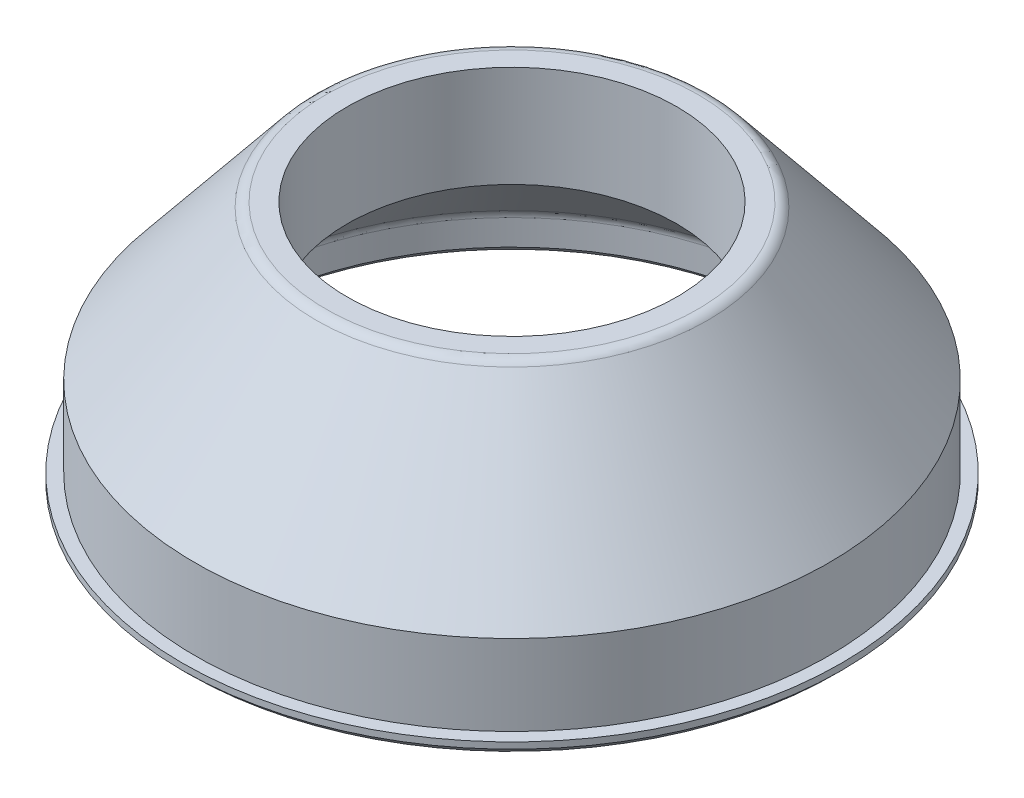
ISO-10303-21;
HEADER;
FILE_DESCRIPTION(('STEP AP214'),'2;1');
FILE_NAME('part.step','',(''),(''),'','','');
FILE_SCHEMA(('AUTOMOTIVE_DESIGN { 1 0 10303 214 1 1 1 1 }'));
ENDSEC;
DATA;
#1=APPLICATION_CONTEXT('core data for automotive mechanical design processes');
#2=APPLICATION_PROTOCOL_DEFINITION('international standard','automotive_design',2000,#1);
#3=PRODUCT_CONTEXT('',#1,'mechanical');
#4=PRODUCT('Part','Part','',(#3));
#5=PRODUCT_RELATED_PRODUCT_CATEGORY('part','',(#4));
#6=PRODUCT_DEFINITION_FORMATION('','',#4);
#7=PRODUCT_DEFINITION_CONTEXT('part definition',#1,'design');
#8=PRODUCT_DEFINITION('design','',#6,#7);
#9=PRODUCT_DEFINITION_SHAPE('','',#8);
#10=(LENGTH_UNIT() NAMED_UNIT(*) SI_UNIT(.MILLI.,.METRE.));
#11=(NAMED_UNIT(*) PLANE_ANGLE_UNIT() SI_UNIT($,.RADIAN.));
#12=(NAMED_UNIT(*) SI_UNIT($,.STERADIAN.) SOLID_ANGLE_UNIT());
#13=UNCERTAINTY_MEASURE_WITH_UNIT(LENGTH_MEASURE(1.E-05),#10,'distance_accuracy_value','');
#14=(GEOMETRIC_REPRESENTATION_CONTEXT(3) GLOBAL_UNCERTAINTY_ASSIGNED_CONTEXT((#13)) GLOBAL_UNIT_ASSIGNED_CONTEXT((#10,
#11,#12)) REPRESENTATION_CONTEXT('',''));
#15=CARTESIAN_POINT('',(0.,0.,0.));
#16=DIRECTION('',(0.,0.,1.));
#17=DIRECTION('',(1.,0.,0.));
#18=AXIS2_PLACEMENT_3D('',#15,#16,#17);
#19=CARTESIAN_POINT('',(0.,0.,0.));
#20=DIRECTION('',(0.,-1.,0.));
#21=DIRECTION('',(0.,0.,-1.));
#22=AXIS2_PLACEMENT_3D('',#19,#20,#21);
#23=CYLINDRICAL_SURFACE('',#22,26.);
#24=CARTESIAN_POINT('',(0.,0.499999999999997,0.));
#25=DIRECTION('',(0.,1.,0.));
#26=DIRECTION('',(0.,0.,1.));
#27=AXIS2_PLACEMENT_3D('',#24,#25,#26);
#28=CIRCLE('',#27,26.);
#29=CARTESIAN_POINT('',(0.,0.499999999999997,26.));
#30=VERTEX_POINT('',#29);
#31=EDGE_CURVE('E10',#30,#30,#28,.T.);
#32=ORIENTED_EDGE('',*,*,#31,.T.);
#33=EDGE_LOOP('',(#32));
#34=FACE_BOUND('',#33,.T.);
#35=CARTESIAN_POINT('',(0.,1.,0.));
#36=DIRECTION('',(0.,-1.,0.));
#37=DIRECTION('',(0.,0.,-1.));
#38=AXIS2_PLACEMENT_3D('',#35,#36,#37);
#39=CIRCLE('',#38,26.);
#40=CARTESIAN_POINT('',(0.,1.,-26.));
#41=VERTEX_POINT('',#40);
#42=EDGE_CURVE('E106',#41,#41,#39,.T.);
#43=ORIENTED_EDGE('',*,*,#42,.T.);
#44=EDGE_LOOP('',(#43));
#45=FACE_BOUND('',#44,.T.);
#46=ADVANCED_FACE('F45',(#34,#45),#23,.T.);
#47=CARTESIAN_POINT('',(-26.,0.,0.));
#48=DIRECTION('',(0.,1.,0.));
#49=DIRECTION('',(0.,0.,1.));
#50=AXIS2_PLACEMENT_3D('',#47,#48,#49);
#51=PLANE('',#50);
#52=CARTESIAN_POINT('',(0.,0.,0.));
#53=DIRECTION('',(0.,1.,0.));
#54=DIRECTION('',(0.,0.,1.));
#55=AXIS2_PLACEMENT_3D('',#52,#53,#54);
#56=CIRCLE('',#55,23.);
#57=CARTESIAN_POINT('',(0.,0.,23.));
#58=VERTEX_POINT('',#57);
#59=EDGE_CURVE('E54',#58,#58,#56,.T.);
#60=ORIENTED_EDGE('',*,*,#59,.T.);
#61=EDGE_LOOP('',(#60));
#62=FACE_BOUND('',#61,.T.);
#63=CARTESIAN_POINT('',(0.,0.,0.));
#64=DIRECTION('',(0.,1.,0.));
#65=DIRECTION('',(0.,0.,1.));
#66=AXIS2_PLACEMENT_3D('',#63,#64,#65);
#67=CIRCLE('',#66,25.5);
#68=CARTESIAN_POINT('',(0.,0.,25.5));
#69=VERTEX_POINT('',#68);
#70=EDGE_CURVE('E59',#69,#69,#67,.F.);
#71=ORIENTED_EDGE('',*,*,#70,.T.);
#72=EDGE_LOOP('',(#71));
#73=FACE_BOUND('',#72,.T.);
#74=ADVANCED_FACE('F138',(#62,#73),#51,.F.);
#75=CARTESIAN_POINT('',(0.,0.,0.));
#76=DIRECTION('',(0.,-1.,0.));
#77=DIRECTION('',(0.,0.,-1.));
#78=AXIS2_PLACEMENT_3D('',#75,#76,#77);
#79=CYLINDRICAL_SURFACE('',#78,22.5);
#80=CARTESIAN_POINT('',(0.,0.499999999999987,0.));
#81=DIRECTION('',(0.,1.,0.));
#82=DIRECTION('',(0.,0.,1.));
#83=AXIS2_PLACEMENT_3D('',#80,#81,#82);
#84=CIRCLE('',#83,22.5);
#85=CARTESIAN_POINT('',(0.,0.499999999999987,22.5));
#86=VERTEX_POINT('',#85);
#87=EDGE_CURVE('E64',#86,#86,#84,.F.);
#88=ORIENTED_EDGE('',*,*,#87,.T.);
#89=EDGE_LOOP('',(#88));
#90=FACE_BOUND('',#89,.T.);
#91=CARTESIAN_POINT('',(0.,2.517766402722,0.));
#92=DIRECTION('',(0.,-1.,0.));
#93=DIRECTION('',(0.,0.,-1.));
#94=AXIS2_PLACEMENT_3D('',#91,#92,#93);
#95=CIRCLE('',#94,22.5);
#96=CARTESIAN_POINT('',(0.,2.517766402722,-22.5));
#97=VERTEX_POINT('',#96);
#98=EDGE_CURVE('E70',#97,#97,#95,.F.);
#99=ORIENTED_EDGE('',*,*,#98,.T.);
#100=EDGE_LOOP('',(#99));
#101=FACE_BOUND('',#100,.T.);
#102=ADVANCED_FACE('F144',(#90,#101),#79,.F.);
#103=CARTESIAN_POINT('',(0.,2.87241726725528,0.));
#104=DIRECTION('',(0.,-1.,0.));
#105=DIRECTION('',(0.,0.,-1.));
#106=AXIS2_PLACEMENT_3D('',#103,#104,#105);
#107=CONICAL_SURFACE('',#106,22.5,0.681624210376533);
#108=CARTESIAN_POINT('',(0.,3.14782153846701,0.));
#109=DIRECTION('',(0.,-1.,0.));
#110=DIRECTION('',(0.,0.,-1.));
#111=AXIS2_PLACEMENT_3D('',#108,#109,#110);
#112=CIRCLE('',#111,22.2765504014044);
#113=CARTESIAN_POINT('',(0.,3.14782153846701,-22.2765504014044));
#114=VERTEX_POINT('',#113);
#115=EDGE_CURVE('E74',#114,#114,#112,.T.);
#116=ORIENTED_EDGE('',*,*,#115,.T.);
#117=EDGE_LOOP('',(#116));
#118=FACE_BOUND('',#117,.T.);
#119=CARTESIAN_POINT('',(0.,11.5,0.));
#120=DIRECTION('',(0.,-1.,0.));
#121=DIRECTION('',(0.,0.,-1.));
#122=AXIS2_PLACEMENT_3D('',#119,#120,#121);
#123=CIRCLE('',#122,15.5);
#124=CARTESIAN_POINT('',(0.,11.5,-15.5));
#125=VERTEX_POINT('',#124);
#126=EDGE_CURVE('E86',#125,#125,#123,.T.);
#127=ORIENTED_EDGE('',*,*,#126,.F.);
#128=EDGE_LOOP('',(#127));
#129=FACE_BOUND('',#128,.T.);
#130=ADVANCED_FACE('F167',(#118,#129),#107,.F.);
#131=CARTESIAN_POINT('',(-15.5,11.5,0.));
#132=DIRECTION('',(0.,1.,0.));
#133=DIRECTION('',(0.,0.,1.));
#134=AXIS2_PLACEMENT_3D('',#131,#132,#133);
#135=PLANE('',#134);
#136=CARTESIAN_POINT('',(0.,11.5,0.));
#137=DIRECTION('',(0.,-1.,0.));
#138=DIRECTION('',(0.,0.,-1.));
#139=AXIS2_PLACEMENT_3D('',#136,#137,#138);
#140=CIRCLE('',#139,13.);
#141=CARTESIAN_POINT('',(0.,11.5,-13.));
#142=VERTEX_POINT('',#141);
#143=EDGE_CURVE('E90',#142,#142,#140,.T.);
#144=ORIENTED_EDGE('',*,*,#143,.F.);
#145=EDGE_LOOP('',(#144));
#146=FACE_BOUND('',#145,.T.);
#147=ORIENTED_EDGE('',*,*,#126,.T.);
#148=EDGE_LOOP('',(#147));
#149=FACE_BOUND('',#148,.T.);
#150=ADVANCED_FACE('F174',(#146,#149),#135,.F.);
#151=CARTESIAN_POINT('',(0.,0.,0.));
#152=DIRECTION('',(0.,-1.,0.));
#153=DIRECTION('',(0.,0.,-1.));
#154=AXIS2_PLACEMENT_3D('',#151,#152,#153);
#155=CYLINDRICAL_SURFACE('',#154,13.);
#156=CARTESIAN_POINT('',(0.,19.5,0.));
#157=DIRECTION('',(0.,-1.,0.));
#158=DIRECTION('',(0.,0.,-1.));
#159=AXIS2_PLACEMENT_3D('',#156,#157,#158);
#160=CIRCLE('',#159,13.);
#161=CARTESIAN_POINT('',(0.,19.5,-13.));
#162=VERTEX_POINT('',#161);
#163=EDGE_CURVE('E94',#162,#162,#160,.T.);
#164=ORIENTED_EDGE('',*,*,#163,.F.);
#165=EDGE_LOOP('',(#164));
#166=FACE_BOUND('',#165,.T.);
#167=ORIENTED_EDGE('',*,*,#143,.T.);
#168=EDGE_LOOP('',(#167));
#169=FACE_BOUND('',#168,.T.);
#170=ADVANCED_FACE('F134',(#166,#169),#155,.F.);
#171=CARTESIAN_POINT('',(-13.,19.5,0.));
#172=DIRECTION('',(0.,-1.,0.));
#173=DIRECTION('',(0.,0.,-1.));
#174=AXIS2_PLACEMENT_3D('',#171,#172,#173);
#175=PLANE('',#174);
#176=CARTESIAN_POINT('',(0.,19.5,0.));
#177=DIRECTION('',(0.,-1.,0.));
#178=DIRECTION('',(0.,0.,-1.));
#179=AXIS2_PLACEMENT_3D('',#176,#177,#178);
#180=CIRCLE('',#179,14.6656871865067);
#181=CARTESIAN_POINT('',(0.,19.5,-14.6656871865067));
#182=VERTEX_POINT('',#181);
#183=EDGE_CURVE('E78',#182,#182,#180,.F.);
#184=ORIENTED_EDGE('',*,*,#183,.T.);
#185=EDGE_LOOP('',(#184));
#186=FACE_BOUND('',#185,.T.);
#187=ORIENTED_EDGE('',*,*,#163,.T.);
#188=EDGE_LOOP('',(#187));
#189=FACE_BOUND('',#188,.T.);
#190=ADVANCED_FACE('F127',(#186,#189),#175,.F.);
#191=CARTESIAN_POINT('',(0.,19.5,0.));
#192=DIRECTION('',(0.,-1.,0.));
#193=DIRECTION('',(0.,0.,-1.));
#194=AXIS2_PLACEMENT_3D('',#191,#192,#193);
#195=CONICAL_SURFACE('',#194,15.1420823613542,0.681624210376533);
#196=CARTESIAN_POINT('',(0.,19.130055135745,0.));
#197=DIRECTION('',(0.,1.,0.));
#198=DIRECTION('',(0.,0.,1.));
#199=AXIS2_PLACEMENT_3D('',#196,#197,#198);
#200=CIRCLE('',#199,15.4422375879111);
#201=CARTESIAN_POINT('',(0.,19.130055135745,15.4422375879111));
#202=VERTEX_POINT('',#201);
#203=EDGE_CURVE('E82',#202,#202,#200,.F.);
#204=ORIENTED_EDGE('',*,*,#203,.T.);
#205=EDGE_LOOP('',(#204));
#206=FACE_BOUND('',#205,.T.);
#207=CARTESIAN_POINT('',(0.,7.35,0.));
#208=DIRECTION('',(0.,-1.,0.));
#209=DIRECTION('',(0.,0.,-1.));
#210=AXIS2_PLACEMENT_3D('',#207,#208,#209);
#211=CIRCLE('',#210,25.);
#212=CARTESIAN_POINT('',(0.,7.35,-25.));
#213=VERTEX_POINT('',#212);
#214=EDGE_CURVE('E98',#213,#213,#211,.T.);
#215=ORIENTED_EDGE('',*,*,#214,.F.);
#216=EDGE_LOOP('',(#215));
#217=FACE_BOUND('',#216,.T.);
#218=ADVANCED_FACE('F122',(#206,#217),#195,.T.);
#219=CARTESIAN_POINT('',(0.,0.,0.));
#220=DIRECTION('',(0.,-1.,0.));
#221=DIRECTION('',(0.,0.,-1.));
#222=AXIS2_PLACEMENT_3D('',#219,#220,#221);
#223=CYLINDRICAL_SURFACE('',#222,25.);
#224=CARTESIAN_POINT('',(0.,1.,0.));
#225=DIRECTION('',(0.,-1.,0.));
#226=DIRECTION('',(0.,0.,-1.));
#227=AXIS2_PLACEMENT_3D('',#224,#225,#226);
#228=CIRCLE('',#227,25.);
#229=CARTESIAN_POINT('',(0.,1.,-25.));
#230=VERTEX_POINT('',#229);
#231=EDGE_CURVE('E102',#230,#230,#228,.T.);
#232=ORIENTED_EDGE('',*,*,#231,.F.);
#233=EDGE_LOOP('',(#232));
#234=FACE_BOUND('',#233,.T.);
#235=ORIENTED_EDGE('',*,*,#214,.T.);
#236=EDGE_LOOP('',(#235));
#237=FACE_BOUND('',#236,.T.);
#238=ADVANCED_FACE('F116',(#234,#237),#223,.T.);
#239=CARTESIAN_POINT('',(-25.,1.,0.));
#240=DIRECTION('',(0.,-1.,0.));
#241=DIRECTION('',(0.,0.,-1.));
#242=AXIS2_PLACEMENT_3D('',#239,#240,#241);
#243=PLANE('',#242);
#244=ORIENTED_EDGE('',*,*,#42,.F.);
#245=EDGE_LOOP('',(#244));
#246=FACE_BOUND('',#245,.T.);
#247=ORIENTED_EDGE('',*,*,#231,.T.);
#248=EDGE_LOOP('',(#247));
#249=FACE_BOUND('',#248,.T.);
#250=ADVANCED_FACE('F112',(#246,#249),#243,.F.);
#251=CARTESIAN_POINT('',(0.,18.5,0.));
#252=DIRECTION('',(0.,-1.,0.));
#253=DIRECTION('',(0.,0.,-1.));
#254=AXIS2_PLACEMENT_3D('',#251,#252,#253);
#255=TOROIDAL_SURFACE('',#254,14.6656871865067,1.);
#256=ORIENTED_EDGE('',*,*,#183,.F.);
#257=EDGE_LOOP('',(#256));
#258=FACE_BOUND('',#257,.T.);
#259=ORIENTED_EDGE('',*,*,#203,.F.);
#260=EDGE_LOOP('',(#259));
#261=FACE_BOUND('',#260,.T.);
#262=ADVANCED_FACE('F115',(#258,#261),#255,.T.);
#263=CARTESIAN_POINT('',(0.,2.517766402722,0.));
#264=DIRECTION('',(0.,-1.,0.));
#265=DIRECTION('',(0.,0.,-1.));
#266=AXIS2_PLACEMENT_3D('',#263,#264,#265);
#267=TOROIDAL_SURFACE('',#266,21.5,1.);
#268=ORIENTED_EDGE('',*,*,#98,.F.);
#269=EDGE_LOOP('',(#268));
#270=FACE_BOUND('',#269,.T.);
#271=ORIENTED_EDGE('',*,*,#115,.F.);
#272=EDGE_LOOP('',(#271));
#273=FACE_BOUND('',#272,.T.);
#274=ADVANCED_FACE('F149',(#270,#273),#267,.F.);
#275=CARTESIAN_POINT('',(0.,0.499999999999987,0.));
#276=DIRECTION('',(0.,-1.,0.));
#277=DIRECTION('',(0.,0.,-1.));
#278=AXIS2_PLACEMENT_3D('',#275,#276,#277);
#279=CONICAL_SURFACE('',#278,22.5,0.785398163397448);
#280=ORIENTED_EDGE('',*,*,#59,.F.);
#281=EDGE_LOOP('',(#280));
#282=FACE_BOUND('',#281,.T.);
#283=ORIENTED_EDGE('',*,*,#87,.F.);
#284=EDGE_LOOP('',(#283));
#285=FACE_BOUND('',#284,.T.);
#286=ADVANCED_FACE('F151',(#282,#285),#279,.F.);
#287=CARTESIAN_POINT('',(0.,0.,0.));
#288=DIRECTION('',(0.,1.,0.));
#289=DIRECTION('',(0.,0.,1.));
#290=AXIS2_PLACEMENT_3D('',#287,#288,#289);
#291=CONICAL_SURFACE('',#290,25.5,0.785398163397452);
#292=ORIENTED_EDGE('',*,*,#31,.F.);
#293=EDGE_LOOP('',(#292));
#294=FACE_BOUND('',#293,.T.);
#295=ORIENTED_EDGE('',*,*,#70,.F.);
#296=EDGE_LOOP('',(#295));
#297=FACE_BOUND('',#296,.T.);
#298=ADVANCED_FACE('F48',(#294,#297),#291,.T.);
#299=CLOSED_SHELL('',(#46,#74,#102,#130,#150,#170,#190,#218,#238,#250,#262,#274,#286,#298));
#300=MANIFOLD_SOLID_BREP('B2',#299);
#301=ADVANCED_BREP_SHAPE_REPRESENTATION('',(#18,#300),#14);
#302=SHAPE_DEFINITION_REPRESENTATION(#9,#301);
ENDSEC;
END-ISO-10303-21;
